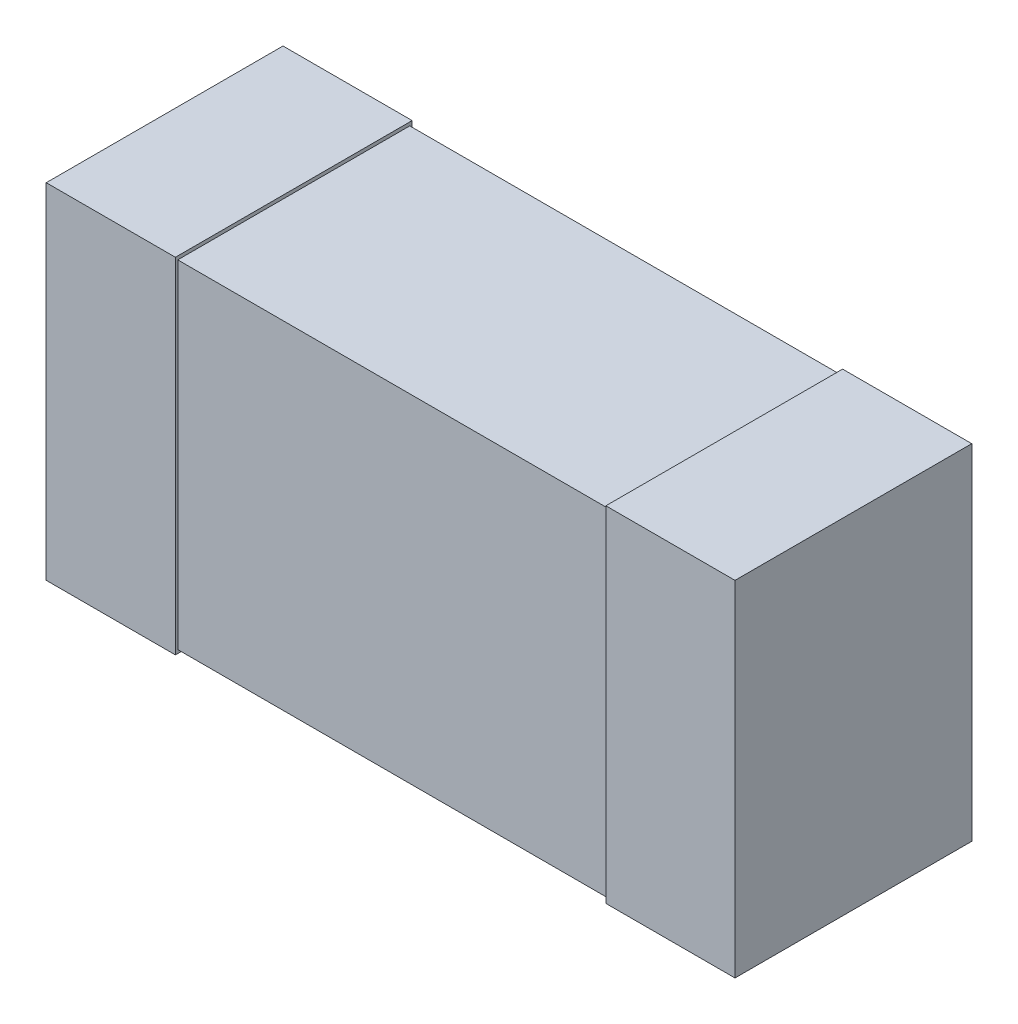
ISO-10303-21;
HEADER;
FILE_DESCRIPTION(('STEP AP214'),'2;1');
FILE_NAME('part.step','',(''),(''),'','','');
FILE_SCHEMA(('AUTOMOTIVE_DESIGN { 1 0 10303 214 1 1 1 1 }'));
ENDSEC;
DATA;
#1=APPLICATION_CONTEXT('core data for automotive mechanical design processes');
#2=APPLICATION_PROTOCOL_DEFINITION('international standard','automotive_design',2000,#1);
#3=PRODUCT_CONTEXT('',#1,'mechanical');
#4=PRODUCT('Part','Part','',(#3));
#5=PRODUCT_RELATED_PRODUCT_CATEGORY('part','',(#4));
#6=PRODUCT_DEFINITION_FORMATION('','',#4);
#7=PRODUCT_DEFINITION_CONTEXT('part definition',#1,'design');
#8=PRODUCT_DEFINITION('design','',#6,#7);
#9=PRODUCT_DEFINITION_SHAPE('','',#8);
#10=(LENGTH_UNIT() NAMED_UNIT(*) SI_UNIT(.MILLI.,.METRE.));
#11=(NAMED_UNIT(*) PLANE_ANGLE_UNIT() SI_UNIT($,.RADIAN.));
#12=(NAMED_UNIT(*) SI_UNIT($,.STERADIAN.) SOLID_ANGLE_UNIT());
#13=UNCERTAINTY_MEASURE_WITH_UNIT(LENGTH_MEASURE(1.E-05),#10,'distance_accuracy_value','');
#14=(GEOMETRIC_REPRESENTATION_CONTEXT(3) GLOBAL_UNCERTAINTY_ASSIGNED_CONTEXT((#13)) GLOBAL_UNIT_ASSIGNED_CONTEXT((#10,
#11,#12)) REPRESENTATION_CONTEXT('',''));
#15=CARTESIAN_POINT('',(0.,0.,0.));
#16=DIRECTION('',(0.,0.,1.));
#17=DIRECTION('',(1.,0.,0.));
#18=AXIS2_PLACEMENT_3D('',#15,#16,#17);
#19=CARTESIAN_POINT('',(-0.8,-0.4,0.));
#20=DIRECTION('',(1.,0.,0.));
#21=DIRECTION('',(0.,0.,1.));
#22=AXIS2_PLACEMENT_3D('',#19,#20,#21);
#23=PLANE('',#22);
#24=DIRECTION('',(0.,1.,0.));
#25=VECTOR('',#24,1.);
#26=CARTESIAN_POINT('',(-0.8,-0.4,0.55));
#27=LINE('',#26,#25);
#28=CARTESIAN_POINT('',(-0.8,-0.4,0.55));
#29=VERTEX_POINT('',#28);
#30=CARTESIAN_POINT('',(-0.8,0.4,0.55));
#31=VERTEX_POINT('',#30);
#32=EDGE_CURVE('P0_E11',#29,#31,#27,.T.);
#33=ORIENTED_EDGE('',*,*,#32,.T.);
#34=DIRECTION('',(0.,0.,1.));
#35=VECTOR('',#34,1.);
#36=CARTESIAN_POINT('',(-0.8,0.4,0.));
#37=LINE('',#36,#35);
#38=CARTESIAN_POINT('',(-0.8,0.4,0.));
#39=VERTEX_POINT('',#38);
#40=EDGE_CURVE('P0_E23',#39,#31,#37,.T.);
#41=ORIENTED_EDGE('',*,*,#40,.F.);
#42=DIRECTION('',(0.,1.,0.));
#43=VECTOR('',#42,1.);
#44=CARTESIAN_POINT('',(-0.8,-0.4,0.));
#45=LINE('',#44,#43);
#46=CARTESIAN_POINT('',(-0.8,-0.4,0.));
#47=VERTEX_POINT('',#46);
#48=EDGE_CURVE('P0_E85',#47,#39,#45,.T.);
#49=ORIENTED_EDGE('',*,*,#48,.F.);
#50=DIRECTION('',(0.,0.,1.));
#51=VECTOR('',#50,1.);
#52=CARTESIAN_POINT('',(-0.8,-0.4,0.));
#53=LINE('',#52,#51);
#54=EDGE_CURVE('P0_E35',#47,#29,#53,.T.);
#55=ORIENTED_EDGE('',*,*,#54,.T.);
#56=EDGE_LOOP('',(#33,#41,#49,#55));
#57=FACE_BOUND('',#56,.T.);
#58=ADVANCED_FACE('P0_F16',(#57),#23,.F.);
#59=CARTESIAN_POINT('',(-0.5,-0.4,0.));
#60=DIRECTION('',(1.,0.,0.));
#61=DIRECTION('',(0.,0.,1.));
#62=AXIS2_PLACEMENT_3D('',#59,#60,#61);
#63=PLANE('',#62);
#64=DIRECTION('',(0.,0.,1.));
#65=VECTOR('',#64,1.);
#66=CARTESIAN_POINT('',(-0.5,-0.4,0.));
#67=LINE('',#66,#65);
#68=CARTESIAN_POINT('',(-0.5,-0.4,0.));
#69=VERTEX_POINT('',#68);
#70=CARTESIAN_POINT('',(-0.5,-0.4,0.55));
#71=VERTEX_POINT('',#70);
#72=EDGE_CURVE('P0_E82',#69,#71,#67,.T.);
#73=ORIENTED_EDGE('',*,*,#72,.F.);
#74=DIRECTION('',(0.,1.,0.));
#75=VECTOR('',#74,1.);
#76=CARTESIAN_POINT('',(-0.5,-0.4,0.));
#77=LINE('',#76,#75);
#78=CARTESIAN_POINT('',(-0.5,0.4,0.));
#79=VERTEX_POINT('',#78);
#80=EDGE_CURVE('P0_E62',#69,#79,#77,.T.);
#81=ORIENTED_EDGE('',*,*,#80,.T.);
#82=DIRECTION('',(0.,0.,1.));
#83=VECTOR('',#82,1.);
#84=CARTESIAN_POINT('',(-0.5,0.4,0.));
#85=LINE('',#84,#83);
#86=CARTESIAN_POINT('',(-0.5,0.4,0.55));
#87=VERTEX_POINT('',#86);
#88=EDGE_CURVE('P0_E56',#79,#87,#85,.T.);
#89=ORIENTED_EDGE('',*,*,#88,.T.);
#90=DIRECTION('',(0.,1.,0.));
#91=VECTOR('',#90,1.);
#92=CARTESIAN_POINT('',(-0.5,-0.4,0.55));
#93=LINE('',#92,#91);
#94=EDGE_CURVE('P0_E59',#71,#87,#93,.T.);
#95=ORIENTED_EDGE('',*,*,#94,.F.);
#96=EDGE_LOOP('',(#73,#81,#89,#95));
#97=FACE_BOUND('',#96,.T.);
#98=ADVANCED_FACE('P0_F58',(#97),#63,.T.);
#99=CARTESIAN_POINT('',(-0.8,-0.4,0.));
#100=DIRECTION('',(0.,1.,0.));
#101=DIRECTION('',(0.,0.,1.));
#102=AXIS2_PLACEMENT_3D('',#99,#100,#101);
#103=PLANE('',#102);
#104=ORIENTED_EDGE('',*,*,#72,.T.);
#105=DIRECTION('',(1.,0.,0.));
#106=VECTOR('',#105,1.);
#107=CARTESIAN_POINT('',(-0.8,-0.4,0.55));
#108=LINE('',#107,#106);
#109=EDGE_CURVE('P0_E70',#29,#71,#108,.T.);
#110=ORIENTED_EDGE('',*,*,#109,.F.);
#111=ORIENTED_EDGE('',*,*,#54,.F.);
#112=DIRECTION('',(1.,0.,0.));
#113=VECTOR('',#112,1.);
#114=CARTESIAN_POINT('',(-0.8,-0.4,0.));
#115=LINE('',#114,#113);
#116=EDGE_CURVE('P0_E75',#47,#69,#115,.T.);
#117=ORIENTED_EDGE('',*,*,#116,.T.);
#118=EDGE_LOOP('',(#104,#110,#111,#117));
#119=FACE_BOUND('',#118,.T.);
#120=ADVANCED_FACE('P0_F90',(#119),#103,.F.);
#121=CARTESIAN_POINT('',(-0.8,0.4,0.));
#122=DIRECTION('',(0.,1.,0.));
#123=DIRECTION('',(0.,0.,1.));
#124=AXIS2_PLACEMENT_3D('',#121,#122,#123);
#125=PLANE('',#124);
#126=DIRECTION('',(1.,0.,0.));
#127=VECTOR('',#126,1.);
#128=CARTESIAN_POINT('',(-0.8,0.4,0.));
#129=LINE('',#128,#127);
#130=EDGE_CURVE('P0_E73',#39,#79,#129,.T.);
#131=ORIENTED_EDGE('',*,*,#130,.F.);
#132=ORIENTED_EDGE('',*,*,#40,.T.);
#133=DIRECTION('',(1.,0.,0.));
#134=VECTOR('',#133,1.);
#135=CARTESIAN_POINT('',(-0.8,0.4,0.55));
#136=LINE('',#135,#134);
#137=EDGE_CURVE('P0_E68',#31,#87,#136,.T.);
#138=ORIENTED_EDGE('',*,*,#137,.T.);
#139=ORIENTED_EDGE('',*,*,#88,.F.);
#140=EDGE_LOOP('',(#131,#132,#138,#139));
#141=FACE_BOUND('',#140,.T.);
#142=ADVANCED_FACE('P0_F72',(#141),#125,.T.);
#143=CARTESIAN_POINT('',(-0.8,-0.4,0.));
#144=DIRECTION('',(0.,0.,1.));
#145=DIRECTION('',(1.,0.,0.));
#146=AXIS2_PLACEMENT_3D('',#143,#144,#145);
#147=PLANE('',#146);
#148=ORIENTED_EDGE('',*,*,#130,.T.);
#149=ORIENTED_EDGE('',*,*,#80,.F.);
#150=ORIENTED_EDGE('',*,*,#116,.F.);
#151=ORIENTED_EDGE('',*,*,#48,.T.);
#152=EDGE_LOOP('',(#148,#149,#150,#151));
#153=FACE_BOUND('',#152,.T.);
#154=ADVANCED_FACE('P0_F88',(#153),#147,.F.);
#155=CARTESIAN_POINT('',(-0.8,-0.4,0.55));
#156=DIRECTION('',(0.,0.,1.));
#157=DIRECTION('',(1.,0.,0.));
#158=AXIS2_PLACEMENT_3D('',#155,#156,#157);
#159=PLANE('',#158);
#160=ORIENTED_EDGE('',*,*,#32,.F.);
#161=ORIENTED_EDGE('',*,*,#109,.T.);
#162=ORIENTED_EDGE('',*,*,#94,.T.);
#163=ORIENTED_EDGE('',*,*,#137,.F.);
#164=EDGE_LOOP('',(#160,#161,#162,#163));
#165=FACE_BOUND('',#164,.T.);
#166=ADVANCED_FACE('P0_F67',(#165),#159,.T.);
#167=CLOSED_SHELL('',(#58,#98,#120,#142,#154,#166));
#168=MANIFOLD_SOLID_BREP('P0_B1',#167);
#169=CARTESIAN_POINT('',(0.5,-0.4,0.));
#170=DIRECTION('',(1.,0.,0.));
#171=DIRECTION('',(0.,0.,1.));
#172=AXIS2_PLACEMENT_3D('',#169,#170,#171);
#173=PLANE('',#172);
#174=DIRECTION('',(0.,1.,0.));
#175=VECTOR('',#174,1.);
#176=CARTESIAN_POINT('',(0.5,-0.4,0.55));
#177=LINE('',#176,#175);
#178=CARTESIAN_POINT('',(0.5,-0.4,0.55));
#179=VERTEX_POINT('',#178);
#180=CARTESIAN_POINT('',(0.5,0.4,0.55));
#181=VERTEX_POINT('',#180);
#182=EDGE_CURVE('P1_E11',#179,#181,#177,.T.);
#183=ORIENTED_EDGE('',*,*,#182,.T.);
#184=DIRECTION('',(0.,0.,1.));
#185=VECTOR('',#184,1.);
#186=CARTESIAN_POINT('',(0.5,0.4,0.));
#187=LINE('',#186,#185);
#188=CARTESIAN_POINT('',(0.5,0.4,0.));
#189=VERTEX_POINT('',#188);
#190=EDGE_CURVE('P1_E23',#189,#181,#187,.T.);
#191=ORIENTED_EDGE('',*,*,#190,.F.);
#192=DIRECTION('',(0.,1.,0.));
#193=VECTOR('',#192,1.);
#194=CARTESIAN_POINT('',(0.5,-0.4,0.));
#195=LINE('',#194,#193);
#196=CARTESIAN_POINT('',(0.5,-0.4,0.));
#197=VERTEX_POINT('',#196);
#198=EDGE_CURVE('P1_E85',#197,#189,#195,.T.);
#199=ORIENTED_EDGE('',*,*,#198,.F.);
#200=DIRECTION('',(0.,0.,1.));
#201=VECTOR('',#200,1.);
#202=CARTESIAN_POINT('',(0.5,-0.4,0.));
#203=LINE('',#202,#201);
#204=EDGE_CURVE('P1_E35',#197,#179,#203,.T.);
#205=ORIENTED_EDGE('',*,*,#204,.T.);
#206=EDGE_LOOP('',(#183,#191,#199,#205));
#207=FACE_BOUND('',#206,.T.);
#208=ADVANCED_FACE('P1_F16',(#207),#173,.F.);
#209=CARTESIAN_POINT('',(0.8,-0.4,0.));
#210=DIRECTION('',(1.,0.,0.));
#211=DIRECTION('',(0.,0.,1.));
#212=AXIS2_PLACEMENT_3D('',#209,#210,#211);
#213=PLANE('',#212);
#214=DIRECTION('',(0.,0.,1.));
#215=VECTOR('',#214,1.);
#216=CARTESIAN_POINT('',(0.8,-0.4,0.));
#217=LINE('',#216,#215);
#218=CARTESIAN_POINT('',(0.8,-0.4,0.));
#219=VERTEX_POINT('',#218);
#220=CARTESIAN_POINT('',(0.8,-0.4,0.55));
#221=VERTEX_POINT('',#220);
#222=EDGE_CURVE('P1_E82',#219,#221,#217,.T.);
#223=ORIENTED_EDGE('',*,*,#222,.F.);
#224=DIRECTION('',(0.,1.,0.));
#225=VECTOR('',#224,1.);
#226=CARTESIAN_POINT('',(0.8,-0.4,0.));
#227=LINE('',#226,#225);
#228=CARTESIAN_POINT('',(0.8,0.4,0.));
#229=VERTEX_POINT('',#228);
#230=EDGE_CURVE('P1_E62',#219,#229,#227,.T.);
#231=ORIENTED_EDGE('',*,*,#230,.T.);
#232=DIRECTION('',(0.,0.,1.));
#233=VECTOR('',#232,1.);
#234=CARTESIAN_POINT('',(0.8,0.4,0.));
#235=LINE('',#234,#233);
#236=CARTESIAN_POINT('',(0.8,0.4,0.55));
#237=VERTEX_POINT('',#236);
#238=EDGE_CURVE('P1_E56',#229,#237,#235,.T.);
#239=ORIENTED_EDGE('',*,*,#238,.T.);
#240=DIRECTION('',(0.,1.,0.));
#241=VECTOR('',#240,1.);
#242=CARTESIAN_POINT('',(0.8,-0.4,0.55));
#243=LINE('',#242,#241);
#244=EDGE_CURVE('P1_E59',#221,#237,#243,.T.);
#245=ORIENTED_EDGE('',*,*,#244,.F.);
#246=EDGE_LOOP('',(#223,#231,#239,#245));
#247=FACE_BOUND('',#246,.T.);
#248=ADVANCED_FACE('P1_F58',(#247),#213,.T.);
#249=CARTESIAN_POINT('',(0.5,-0.4,0.));
#250=DIRECTION('',(0.,1.,0.));
#251=DIRECTION('',(0.,0.,1.));
#252=AXIS2_PLACEMENT_3D('',#249,#250,#251);
#253=PLANE('',#252);
#254=ORIENTED_EDGE('',*,*,#222,.T.);
#255=DIRECTION('',(1.,0.,0.));
#256=VECTOR('',#255,1.);
#257=CARTESIAN_POINT('',(0.5,-0.4,0.55));
#258=LINE('',#257,#256);
#259=EDGE_CURVE('P1_E70',#179,#221,#258,.T.);
#260=ORIENTED_EDGE('',*,*,#259,.F.);
#261=ORIENTED_EDGE('',*,*,#204,.F.);
#262=DIRECTION('',(1.,0.,0.));
#263=VECTOR('',#262,1.);
#264=CARTESIAN_POINT('',(0.5,-0.4,0.));
#265=LINE('',#264,#263);
#266=EDGE_CURVE('P1_E75',#197,#219,#265,.T.);
#267=ORIENTED_EDGE('',*,*,#266,.T.);
#268=EDGE_LOOP('',(#254,#260,#261,#267));
#269=FACE_BOUND('',#268,.T.);
#270=ADVANCED_FACE('P1_F90',(#269),#253,.F.);
#271=CARTESIAN_POINT('',(0.5,0.4,0.));
#272=DIRECTION('',(0.,1.,0.));
#273=DIRECTION('',(0.,0.,1.));
#274=AXIS2_PLACEMENT_3D('',#271,#272,#273);
#275=PLANE('',#274);
#276=DIRECTION('',(1.,0.,0.));
#277=VECTOR('',#276,1.);
#278=CARTESIAN_POINT('',(0.5,0.4,0.));
#279=LINE('',#278,#277);
#280=EDGE_CURVE('P1_E73',#189,#229,#279,.T.);
#281=ORIENTED_EDGE('',*,*,#280,.F.);
#282=ORIENTED_EDGE('',*,*,#190,.T.);
#283=DIRECTION('',(1.,0.,0.));
#284=VECTOR('',#283,1.);
#285=CARTESIAN_POINT('',(0.5,0.4,0.55));
#286=LINE('',#285,#284);
#287=EDGE_CURVE('P1_E68',#181,#237,#286,.T.);
#288=ORIENTED_EDGE('',*,*,#287,.T.);
#289=ORIENTED_EDGE('',*,*,#238,.F.);
#290=EDGE_LOOP('',(#281,#282,#288,#289));
#291=FACE_BOUND('',#290,.T.);
#292=ADVANCED_FACE('P1_F72',(#291),#275,.T.);
#293=CARTESIAN_POINT('',(0.5,-0.4,0.));
#294=DIRECTION('',(0.,0.,1.));
#295=DIRECTION('',(1.,0.,0.));
#296=AXIS2_PLACEMENT_3D('',#293,#294,#295);
#297=PLANE('',#296);
#298=ORIENTED_EDGE('',*,*,#280,.T.);
#299=ORIENTED_EDGE('',*,*,#230,.F.);
#300=ORIENTED_EDGE('',*,*,#266,.F.);
#301=ORIENTED_EDGE('',*,*,#198,.T.);
#302=EDGE_LOOP('',(#298,#299,#300,#301));
#303=FACE_BOUND('',#302,.T.);
#304=ADVANCED_FACE('P1_F88',(#303),#297,.F.);
#305=CARTESIAN_POINT('',(0.5,-0.4,0.55));
#306=DIRECTION('',(0.,0.,1.));
#307=DIRECTION('',(1.,0.,0.));
#308=AXIS2_PLACEMENT_3D('',#305,#306,#307);
#309=PLANE('',#308);
#310=ORIENTED_EDGE('',*,*,#182,.F.);
#311=ORIENTED_EDGE('',*,*,#259,.T.);
#312=ORIENTED_EDGE('',*,*,#244,.T.);
#313=ORIENTED_EDGE('',*,*,#287,.F.);
#314=EDGE_LOOP('',(#310,#311,#312,#313));
#315=FACE_BOUND('',#314,.T.);
#316=ADVANCED_FACE('P1_F67',(#315),#309,.T.);
#317=CLOSED_SHELL('',(#208,#248,#270,#292,#304,#316));
#318=MANIFOLD_SOLID_BREP('P1_B1',#317);
#319=CARTESIAN_POINT('',(-0.5,-0.392,0.0055));
#320=DIRECTION('',(1.,0.,0.));
#321=DIRECTION('',(0.,0.,1.));
#322=AXIS2_PLACEMENT_3D('',#319,#320,#321);
#323=PLANE('',#322);
#324=DIRECTION('',(0.,1.,0.));
#325=VECTOR('',#324,1.);
#326=CARTESIAN_POINT('',(-0.5,-0.392,0.5445));
#327=LINE('',#326,#325);
#328=CARTESIAN_POINT('',(-0.5,-0.392,0.5445));
#329=VERTEX_POINT('',#328);
#330=CARTESIAN_POINT('',(-0.5,0.392,0.5445));
#331=VERTEX_POINT('',#330);
#332=EDGE_CURVE('P2_E11',#329,#331,#327,.T.);
#333=ORIENTED_EDGE('',*,*,#332,.T.);
#334=DIRECTION('',(0.,0.,1.));
#335=VECTOR('',#334,1.);
#336=CARTESIAN_POINT('',(-0.5,0.392,0.0055));
#337=LINE('',#336,#335);
#338=CARTESIAN_POINT('',(-0.5,0.392,0.0055));
#339=VERTEX_POINT('',#338);
#340=EDGE_CURVE('P2_E23',#339,#331,#337,.T.);
#341=ORIENTED_EDGE('',*,*,#340,.F.);
#342=DIRECTION('',(0.,1.,0.));
#343=VECTOR('',#342,1.);
#344=CARTESIAN_POINT('',(-0.5,-0.392,0.0055));
#345=LINE('',#344,#343);
#346=CARTESIAN_POINT('',(-0.5,-0.392,0.0055));
#347=VERTEX_POINT('',#346);
#348=EDGE_CURVE('P2_E85',#347,#339,#345,.T.);
#349=ORIENTED_EDGE('',*,*,#348,.F.);
#350=DIRECTION('',(0.,0.,1.));
#351=VECTOR('',#350,1.);
#352=CARTESIAN_POINT('',(-0.5,-0.392,0.0055));
#353=LINE('',#352,#351);
#354=EDGE_CURVE('P2_E35',#347,#329,#353,.T.);
#355=ORIENTED_EDGE('',*,*,#354,.T.);
#356=EDGE_LOOP('',(#333,#341,#349,#355));
#357=FACE_BOUND('',#356,.T.);
#358=ADVANCED_FACE('P2_F16',(#357),#323,.F.);
#359=CARTESIAN_POINT('',(0.5,-0.392,0.0055));
#360=DIRECTION('',(1.,0.,0.));
#361=DIRECTION('',(0.,0.,1.));
#362=AXIS2_PLACEMENT_3D('',#359,#360,#361);
#363=PLANE('',#362);
#364=DIRECTION('',(0.,0.,1.));
#365=VECTOR('',#364,1.);
#366=CARTESIAN_POINT('',(0.5,-0.392,0.0055));
#367=LINE('',#366,#365);
#368=CARTESIAN_POINT('',(0.5,-0.392,0.0055));
#369=VERTEX_POINT('',#368);
#370=CARTESIAN_POINT('',(0.5,-0.392,0.5445));
#371=VERTEX_POINT('',#370);
#372=EDGE_CURVE('P2_E82',#369,#371,#367,.T.);
#373=ORIENTED_EDGE('',*,*,#372,.F.);
#374=DIRECTION('',(0.,1.,0.));
#375=VECTOR('',#374,1.);
#376=CARTESIAN_POINT('',(0.5,-0.392,0.0055));
#377=LINE('',#376,#375);
#378=CARTESIAN_POINT('',(0.5,0.392,0.0055));
#379=VERTEX_POINT('',#378);
#380=EDGE_CURVE('P2_E62',#369,#379,#377,.T.);
#381=ORIENTED_EDGE('',*,*,#380,.T.);
#382=DIRECTION('',(0.,0.,1.));
#383=VECTOR('',#382,1.);
#384=CARTESIAN_POINT('',(0.5,0.392,0.0055));
#385=LINE('',#384,#383);
#386=CARTESIAN_POINT('',(0.5,0.392,0.5445));
#387=VERTEX_POINT('',#386);
#388=EDGE_CURVE('P2_E55',#379,#387,#385,.T.);
#389=ORIENTED_EDGE('',*,*,#388,.T.);
#390=DIRECTION('',(0.,1.,0.));
#391=VECTOR('',#390,1.);
#392=CARTESIAN_POINT('',(0.5,-0.392,0.5445));
#393=LINE('',#392,#391);
#394=EDGE_CURVE('P2_E59',#371,#387,#393,.T.);
#395=ORIENTED_EDGE('',*,*,#394,.F.);
#396=EDGE_LOOP('',(#373,#381,#389,#395));
#397=FACE_BOUND('',#396,.T.);
#398=ADVANCED_FACE('P2_F58',(#397),#363,.T.);
#399=CARTESIAN_POINT('',(-0.5,-0.392,0.0055));
#400=DIRECTION('',(0.,1.,0.));
#401=DIRECTION('',(0.,0.,1.));
#402=AXIS2_PLACEMENT_3D('',#399,#400,#401);
#403=PLANE('',#402);
#404=ORIENTED_EDGE('',*,*,#372,.T.);
#405=DIRECTION('',(1.,0.,0.));
#406=VECTOR('',#405,1.);
#407=CARTESIAN_POINT('',(-0.5,-0.392,0.5445));
#408=LINE('',#407,#406);
#409=EDGE_CURVE('P2_E70',#329,#371,#408,.T.);
#410=ORIENTED_EDGE('',*,*,#409,.F.);
#411=ORIENTED_EDGE('',*,*,#354,.F.);
#412=DIRECTION('',(1.,0.,0.));
#413=VECTOR('',#412,1.);
#414=CARTESIAN_POINT('',(-0.5,-0.392,0.0055));
#415=LINE('',#414,#413);
#416=EDGE_CURVE('P2_E76',#347,#369,#415,.T.);
#417=ORIENTED_EDGE('',*,*,#416,.T.);
#418=EDGE_LOOP('',(#404,#410,#411,#417));
#419=FACE_BOUND('',#418,.T.);
#420=ADVANCED_FACE('P2_F90',(#419),#403,.F.);
#421=CARTESIAN_POINT('',(-0.5,0.392,0.0055));
#422=DIRECTION('',(0.,1.,0.));
#423=DIRECTION('',(0.,0.,1.));
#424=AXIS2_PLACEMENT_3D('',#421,#422,#423);
#425=PLANE('',#424);
#426=DIRECTION('',(1.,0.,0.));
#427=VECTOR('',#426,1.);
#428=CARTESIAN_POINT('',(-0.5,0.392,0.0055));
#429=LINE('',#428,#427);
#430=EDGE_CURVE('P2_E74',#339,#379,#429,.T.);
#431=ORIENTED_EDGE('',*,*,#430,.F.);
#432=ORIENTED_EDGE('',*,*,#340,.T.);
#433=DIRECTION('',(1.,0.,0.));
#434=VECTOR('',#433,1.);
#435=CARTESIAN_POINT('',(-0.5,0.392,0.5445));
#436=LINE('',#435,#434);
#437=EDGE_CURVE('P2_E68',#331,#387,#436,.T.);
#438=ORIENTED_EDGE('',*,*,#437,.T.);
#439=ORIENTED_EDGE('',*,*,#388,.F.);
#440=EDGE_LOOP('',(#431,#432,#438,#439));
#441=FACE_BOUND('',#440,.T.);
#442=ADVANCED_FACE('P2_F73',(#441),#425,.T.);
#443=CARTESIAN_POINT('',(-0.5,-0.392,0.0055));
#444=DIRECTION('',(0.,0.,1.));
#445=DIRECTION('',(1.,0.,0.));
#446=AXIS2_PLACEMENT_3D('',#443,#444,#445);
#447=PLANE('',#446);
#448=ORIENTED_EDGE('',*,*,#430,.T.);
#449=ORIENTED_EDGE('',*,*,#380,.F.);
#450=ORIENTED_EDGE('',*,*,#416,.F.);
#451=ORIENTED_EDGE('',*,*,#348,.T.);
#452=EDGE_LOOP('',(#448,#449,#450,#451));
#453=FACE_BOUND('',#452,.T.);
#454=ADVANCED_FACE('P2_F88',(#453),#447,.F.);
#455=CARTESIAN_POINT('',(-0.5,-0.392,0.5445));
#456=DIRECTION('',(0.,0.,1.));
#457=DIRECTION('',(1.,0.,0.));
#458=AXIS2_PLACEMENT_3D('',#455,#456,#457);
#459=PLANE('',#458);
#460=ORIENTED_EDGE('',*,*,#332,.F.);
#461=ORIENTED_EDGE('',*,*,#409,.T.);
#462=ORIENTED_EDGE('',*,*,#394,.T.);
#463=ORIENTED_EDGE('',*,*,#437,.F.);
#464=EDGE_LOOP('',(#460,#461,#462,#463));
#465=FACE_BOUND('',#464,.T.);
#466=ADVANCED_FACE('P2_F67',(#465),#459,.T.);
#467=CLOSED_SHELL('',(#358,#398,#420,#442,#454,#466));
#468=MANIFOLD_SOLID_BREP('P2_B1',#467);
#469=ADVANCED_BREP_SHAPE_REPRESENTATION('',(#18,#168,#318,#468),#14);
#470=SHAPE_DEFINITION_REPRESENTATION(#9,#469);
ENDSEC;
END-ISO-10303-21;
